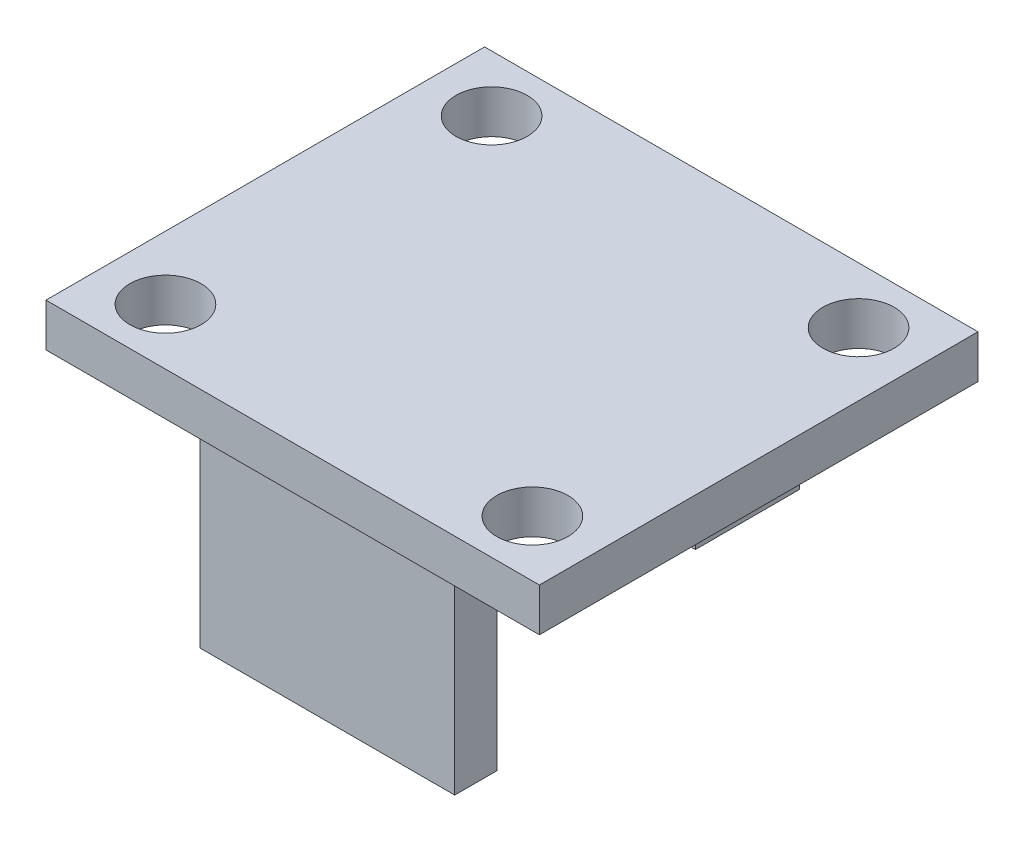
ISO-10303-21;
HEADER;
FILE_DESCRIPTION(('STEP AP214'),'2;1');
FILE_NAME('part.step','',(''),(''),'','','');
FILE_SCHEMA(('AUTOMOTIVE_DESIGN { 1 0 10303 214 1 1 1 1 }'));
ENDSEC;
DATA;
#1=APPLICATION_CONTEXT('core data for automotive mechanical design processes');
#2=APPLICATION_PROTOCOL_DEFINITION('international standard','automotive_design',2000,#1);
#3=PRODUCT_CONTEXT('',#1,'mechanical');
#4=PRODUCT('Part','Part','',(#3));
#5=PRODUCT_RELATED_PRODUCT_CATEGORY('part','',(#4));
#6=PRODUCT_DEFINITION_FORMATION('','',#4);
#7=PRODUCT_DEFINITION_CONTEXT('part definition',#1,'design');
#8=PRODUCT_DEFINITION('design','',#6,#7);
#9=PRODUCT_DEFINITION_SHAPE('','',#8);
#10=(LENGTH_UNIT() NAMED_UNIT(*) SI_UNIT(.MILLI.,.METRE.));
#11=(NAMED_UNIT(*) PLANE_ANGLE_UNIT() SI_UNIT($,.RADIAN.));
#12=(NAMED_UNIT(*) SI_UNIT($,.STERADIAN.) SOLID_ANGLE_UNIT());
#13=UNCERTAINTY_MEASURE_WITH_UNIT(LENGTH_MEASURE(1.E-05),#10,'distance_accuracy_value','');
#14=(GEOMETRIC_REPRESENTATION_CONTEXT(3) GLOBAL_UNCERTAINTY_ASSIGNED_CONTEXT((#13)) GLOBAL_UNIT_ASSIGNED_CONTEXT((#10,
#11,#12)) REPRESENTATION_CONTEXT('',''));
#15=CARTESIAN_POINT('',(0.,0.,0.));
#16=DIRECTION('',(0.,0.,1.));
#17=DIRECTION('',(1.,0.,0.));
#18=AXIS2_PLACEMENT_3D('',#15,#16,#17);
#19=CARTESIAN_POINT('',(0.,0.,0.));
#20=DIRECTION('',(0.,1.,0.));
#21=DIRECTION('',(0.,0.,1.));
#22=AXIS2_PLACEMENT_3D('',#19,#20,#21);
#23=PLANE('',#22);
#24=DIRECTION('',(0.,0.,1.));
#25=VECTOR('',#24,1.);
#26=CARTESIAN_POINT('',(5.89814227713465,0.,6.5862588761337));
#27=LINE('',#26,#25);
#28=CARTESIAN_POINT('',(5.89814227713465,0.,6.5862588761337));
#29=VERTEX_POINT('',#28);
#30=CARTESIAN_POINT('',(5.89814227713465,0.,8.55230630184525));
#31=VERTEX_POINT('',#30);
#32=EDGE_CURVE('E176',#29,#31,#27,.T.);
#33=ORIENTED_EDGE('',*,*,#32,.F.);
#34=DIRECTION('',(1.,0.,0.));
#35=VECTOR('',#34,1.);
#36=CARTESIAN_POINT('',(-5.89814227713465,0.,6.5862588761337));
#37=LINE('',#36,#35);
#38=CARTESIAN_POINT('',(-5.89814227713465,0.,6.5862588761337));
#39=VERTEX_POINT('',#38);
#40=EDGE_CURVE('E193',#39,#29,#37,.T.);
#41=ORIENTED_EDGE('',*,*,#40,.F.);
#42=DIRECTION('',(0.,0.,-1.));
#43=VECTOR('',#42,1.);
#44=CARTESIAN_POINT('',(-5.89814227713465,0.,6.5862588761337));
#45=LINE('',#44,#43);
#46=CARTESIAN_POINT('',(-5.89814227713465,0.,8.55230630184525));
#47=VERTEX_POINT('',#46);
#48=EDGE_CURVE('E206',#47,#39,#45,.T.);
#49=ORIENTED_EDGE('',*,*,#48,.F.);
#50=DIRECTION('',(-1.,0.,0.));
#51=VECTOR('',#50,1.);
#52=CARTESIAN_POINT('',(-5.89814227713465,0.,8.55230630184525));
#53=LINE('',#52,#51);
#54=EDGE_CURVE('E181',#31,#47,#53,.T.);
#55=ORIENTED_EDGE('',*,*,#54,.F.);
#56=EDGE_LOOP('',(#33,#41,#49,#55));
#57=FACE_BOUND('',#56,.T.);
#58=DIRECTION('',(0.,0.,1.));
#59=VECTOR('',#58,1.);
#60=CARTESIAN_POINT('',(-11.43,0.,10.16));
#61=LINE('',#60,#59);
#62=CARTESIAN_POINT('',(-11.43,0.,-10.16));
#63=VERTEX_POINT('',#62);
#64=CARTESIAN_POINT('',(-11.43,0.,10.16));
#65=VERTEX_POINT('',#64);
#66=EDGE_CURVE('E257',#63,#65,#61,.T.);
#67=ORIENTED_EDGE('',*,*,#66,.F.);
#68=DIRECTION('',(-1.,0.,0.));
#69=VECTOR('',#68,1.);
#70=CARTESIAN_POINT('',(11.43,0.,-10.16));
#71=LINE('',#70,#69);
#72=CARTESIAN_POINT('',(11.43,0.,-10.16));
#73=VERTEX_POINT('',#72);
#74=EDGE_CURVE('E266',#73,#63,#71,.T.);
#75=ORIENTED_EDGE('',*,*,#74,.F.);
#76=DIRECTION('',(0.,0.,-1.));
#77=VECTOR('',#76,1.);
#78=CARTESIAN_POINT('',(11.43,0.,10.16));
#79=LINE('',#78,#77);
#80=CARTESIAN_POINT('',(11.43,0.,10.16));
#81=VERTEX_POINT('',#80);
#82=EDGE_CURVE('E282',#81,#73,#79,.T.);
#83=ORIENTED_EDGE('',*,*,#82,.F.);
#84=DIRECTION('',(1.,0.,0.));
#85=VECTOR('',#84,1.);
#86=CARTESIAN_POINT('',(11.43,0.,10.16));
#87=LINE('',#86,#85);
#88=EDGE_CURVE('E279',#65,#81,#87,.T.);
#89=ORIENTED_EDGE('',*,*,#88,.F.);
#90=EDGE_LOOP('',(#67,#75,#83,#89));
#91=FACE_BOUND('',#90,.T.);
#92=CARTESIAN_POINT('',(-8.5,0.,-7.55555555555556));
#93=DIRECTION('',(0.,1.,0.));
#94=DIRECTION('',(0.,0.,1.));
#95=AXIS2_PLACEMENT_3D('',#92,#93,#94);
#96=CIRCLE('',#95,1.65);
#97=CARTESIAN_POINT('',(-8.5,0.,-5.90555555555556));
#98=VERTEX_POINT('',#97);
#99=EDGE_CURVE('E249',#98,#98,#96,.T.);
#100=ORIENTED_EDGE('',*,*,#99,.T.);
#101=EDGE_LOOP('',(#100));
#102=FACE_BOUND('',#101,.T.);
#103=CARTESIAN_POINT('',(8.5,0.,-7.55555555555556));
#104=DIRECTION('',(0.,1.,0.));
#105=DIRECTION('',(0.,0.,1.));
#106=AXIS2_PLACEMENT_3D('',#103,#104,#105);
#107=CIRCLE('',#106,1.65);
#108=CARTESIAN_POINT('',(8.5,0.,-5.90555555555556));
#109=VERTEX_POINT('',#108);
#110=EDGE_CURVE('E241',#109,#109,#107,.T.);
#111=ORIENTED_EDGE('',*,*,#110,.T.);
#112=EDGE_LOOP('',(#111));
#113=FACE_BOUND('',#112,.T.);
#114=CARTESIAN_POINT('',(-8.5,0.,7.55555555555556));
#115=DIRECTION('',(0.,1.,0.));
#116=DIRECTION('',(0.,0.,1.));
#117=AXIS2_PLACEMENT_3D('',#114,#115,#116);
#118=CIRCLE('',#117,1.65);
#119=CARTESIAN_POINT('',(-8.5,0.,9.20555555555555));
#120=VERTEX_POINT('',#119);
#121=EDGE_CURVE('E233',#120,#120,#118,.T.);
#122=ORIENTED_EDGE('',*,*,#121,.T.);
#123=EDGE_LOOP('',(#122));
#124=FACE_BOUND('',#123,.T.);
#125=CARTESIAN_POINT('',(8.5,0.,7.55555555555556));
#126=DIRECTION('',(0.,1.,0.));
#127=DIRECTION('',(0.,0.,1.));
#128=AXIS2_PLACEMENT_3D('',#125,#126,#127);
#129=CIRCLE('',#128,1.65);
#130=CARTESIAN_POINT('',(8.5,0.,9.20555555555556));
#131=VERTEX_POINT('',#130);
#132=EDGE_CURVE('E228',#131,#131,#129,.T.);
#133=ORIENTED_EDGE('',*,*,#132,.T.);
#134=EDGE_LOOP('',(#133));
#135=FACE_BOUND('',#134,.T.);
#136=DIRECTION('',(0.,0.,1.));
#137=VECTOR('',#136,1.);
#138=CARTESIAN_POINT('',(3.62314454166843,0.,-9.70384836547632));
#139=LINE('',#138,#137);
#140=CARTESIAN_POINT('',(3.62314454166843,0.,-9.70384836547632));
#141=VERTEX_POINT('',#140);
#142=CARTESIAN_POINT('',(3.62314454166843,0.,-4.87298897658508));
#143=VERTEX_POINT('',#142);
#144=EDGE_CURVE('E174',#141,#143,#139,.T.);
#145=ORIENTED_EDGE('',*,*,#144,.F.);
#146=DIRECTION('',(1.,0.,0.));
#147=VECTOR('',#146,1.);
#148=CARTESIAN_POINT('',(-3.62314454166843,0.,-9.70384836547632));
#149=LINE('',#148,#147);
#150=CARTESIAN_POINT('',(-3.62314454166843,0.,-9.70384836547632));
#151=VERTEX_POINT('',#150);
#152=EDGE_CURVE('E171',#151,#141,#149,.T.);
#153=ORIENTED_EDGE('',*,*,#152,.F.);
#154=DIRECTION('',(0.,0.,-1.));
#155=VECTOR('',#154,1.);
#156=CARTESIAN_POINT('',(-3.62314454166843,0.,-9.70384836547632));
#157=LINE('',#156,#155);
#158=CARTESIAN_POINT('',(-3.62314454166843,0.,-4.87298897658508));
#159=VERTEX_POINT('',#158);
#160=EDGE_CURVE('E65',#159,#151,#157,.T.);
#161=ORIENTED_EDGE('',*,*,#160,.F.);
#162=DIRECTION('',(-1.,0.,0.));
#163=VECTOR('',#162,1.);
#164=CARTESIAN_POINT('',(-3.62314454166843,0.,-4.87298897658508));
#165=LINE('',#164,#163);
#166=EDGE_CURVE('E57',#143,#159,#165,.T.);
#167=ORIENTED_EDGE('',*,*,#166,.F.);
#168=EDGE_LOOP('',(#145,#153,#161,#167));
#169=FACE_BOUND('',#168,.T.);
#170=ADVANCED_FACE('F38',(#57,#91,#102,#113,#124,#135,#169),#23,.F.);
#171=CARTESIAN_POINT('',(0.,2.,0.));
#172=DIRECTION('',(0.,1.,0.));
#173=DIRECTION('',(0.,0.,1.));
#174=AXIS2_PLACEMENT_3D('',#171,#172,#173);
#175=PLANE('',#174);
#176=CARTESIAN_POINT('',(-8.5,2.,7.55555555555556));
#177=DIRECTION('',(0.,1.,0.));
#178=DIRECTION('',(0.,0.,1.));
#179=AXIS2_PLACEMENT_3D('',#176,#177,#178);
#180=CIRCLE('',#179,1.65);
#181=CARTESIAN_POINT('',(-8.5,2.,9.20555555555555));
#182=VERTEX_POINT('',#181);
#183=EDGE_CURVE('E237',#182,#182,#180,.T.);
#184=ORIENTED_EDGE('',*,*,#183,.F.);
#185=EDGE_LOOP('',(#184));
#186=FACE_BOUND('',#185,.T.);
#187=CARTESIAN_POINT('',(-8.5,2.,-7.55555555555556));
#188=DIRECTION('',(0.,1.,0.));
#189=DIRECTION('',(0.,0.,1.));
#190=AXIS2_PLACEMENT_3D('',#187,#188,#189);
#191=CIRCLE('',#190,1.65);
#192=CARTESIAN_POINT('',(-8.5,2.,-5.90555555555556));
#193=VERTEX_POINT('',#192);
#194=EDGE_CURVE('E253',#193,#193,#191,.T.);
#195=ORIENTED_EDGE('',*,*,#194,.F.);
#196=EDGE_LOOP('',(#195));
#197=FACE_BOUND('',#196,.T.);
#198=DIRECTION('',(0.,0.,1.));
#199=VECTOR('',#198,1.);
#200=CARTESIAN_POINT('',(-11.43,2.,10.16));
#201=LINE('',#200,#199);
#202=CARTESIAN_POINT('',(-11.43,2.,-10.16));
#203=VERTEX_POINT('',#202);
#204=CARTESIAN_POINT('',(-11.43,2.,10.16));
#205=VERTEX_POINT('',#204);
#206=EDGE_CURVE('E261',#203,#205,#201,.T.);
#207=ORIENTED_EDGE('',*,*,#206,.T.);
#208=DIRECTION('',(1.,0.,0.));
#209=VECTOR('',#208,1.);
#210=CARTESIAN_POINT('',(11.43,2.,10.16));
#211=LINE('',#210,#209);
#212=CARTESIAN_POINT('',(11.43,2.,10.16));
#213=VERTEX_POINT('',#212);
#214=EDGE_CURVE('E265',#205,#213,#211,.T.);
#215=ORIENTED_EDGE('',*,*,#214,.T.);
#216=DIRECTION('',(0.,0.,-1.));
#217=VECTOR('',#216,1.);
#218=CARTESIAN_POINT('',(11.43,2.,10.16));
#219=LINE('',#218,#217);
#220=CARTESIAN_POINT('',(11.43,2.,-10.16));
#221=VERTEX_POINT('',#220);
#222=EDGE_CURVE('E269',#213,#221,#219,.T.);
#223=ORIENTED_EDGE('',*,*,#222,.T.);
#224=DIRECTION('',(-1.,0.,0.));
#225=VECTOR('',#224,1.);
#226=CARTESIAN_POINT('',(11.43,2.,-10.16));
#227=LINE('',#226,#225);
#228=EDGE_CURVE('E272',#221,#203,#227,.T.);
#229=ORIENTED_EDGE('',*,*,#228,.T.);
#230=EDGE_LOOP('',(#207,#215,#223,#229));
#231=FACE_BOUND('',#230,.T.);
#232=CARTESIAN_POINT('',(8.5,2.,-7.55555555555556));
#233=DIRECTION('',(0.,1.,0.));
#234=DIRECTION('',(0.,0.,1.));
#235=AXIS2_PLACEMENT_3D('',#232,#233,#234);
#236=CIRCLE('',#235,1.65);
#237=CARTESIAN_POINT('',(8.5,2.,-5.90555555555556));
#238=VERTEX_POINT('',#237);
#239=EDGE_CURVE('E245',#238,#238,#236,.T.);
#240=ORIENTED_EDGE('',*,*,#239,.F.);
#241=EDGE_LOOP('',(#240));
#242=FACE_BOUND('',#241,.T.);
#243=CARTESIAN_POINT('',(8.5,2.,7.55555555555556));
#244=DIRECTION('',(0.,1.,0.));
#245=DIRECTION('',(0.,0.,1.));
#246=AXIS2_PLACEMENT_3D('',#243,#244,#245);
#247=CIRCLE('',#246,1.65);
#248=CARTESIAN_POINT('',(8.5,2.,9.20555555555556));
#249=VERTEX_POINT('',#248);
#250=EDGE_CURVE('E229',#249,#249,#247,.T.);
#251=ORIENTED_EDGE('',*,*,#250,.F.);
#252=EDGE_LOOP('',(#251));
#253=FACE_BOUND('',#252,.T.);
#254=ADVANCED_FACE('F314',(#186,#197,#231,#242,#253),#175,.T.);
#255=CARTESIAN_POINT('',(-11.43,2.,10.16));
#256=DIRECTION('',(1.,0.,0.));
#257=DIRECTION('',(0.,0.,-1.));
#258=AXIS2_PLACEMENT_3D('',#255,#256,#257);
#259=PLANE('',#258);
#260=ORIENTED_EDGE('',*,*,#66,.T.);
#261=DIRECTION('',(0.,-1.,0.));
#262=VECTOR('',#261,1.);
#263=CARTESIAN_POINT('',(-11.43,2.,10.16));
#264=LINE('',#263,#262);
#265=EDGE_CURVE('E11',#205,#65,#264,.T.);
#266=ORIENTED_EDGE('',*,*,#265,.F.);
#267=ORIENTED_EDGE('',*,*,#206,.F.);
#268=DIRECTION('',(0.,-1.,0.));
#269=VECTOR('',#268,1.);
#270=CARTESIAN_POINT('',(-11.43,2.,-10.16));
#271=LINE('',#270,#269);
#272=EDGE_CURVE('E275',#203,#63,#271,.T.);
#273=ORIENTED_EDGE('',*,*,#272,.T.);
#274=EDGE_LOOP('',(#260,#266,#267,#273));
#275=FACE_BOUND('',#274,.T.);
#276=ADVANCED_FACE('F40',(#275),#259,.F.);
#277=CARTESIAN_POINT('',(11.43,2.,10.16));
#278=DIRECTION('',(0.,0.,-1.));
#279=DIRECTION('',(-1.,0.,0.));
#280=AXIS2_PLACEMENT_3D('',#277,#278,#279);
#281=PLANE('',#280);
#282=ORIENTED_EDGE('',*,*,#88,.T.);
#283=DIRECTION('',(0.,-1.,0.));
#284=VECTOR('',#283,1.);
#285=CARTESIAN_POINT('',(11.43,2.,10.16));
#286=LINE('',#285,#284);
#287=EDGE_CURVE('E47',#213,#81,#286,.T.);
#288=ORIENTED_EDGE('',*,*,#287,.F.);
#289=ORIENTED_EDGE('',*,*,#214,.F.);
#290=ORIENTED_EDGE('',*,*,#265,.T.);
#291=EDGE_LOOP('',(#282,#288,#289,#290));
#292=FACE_BOUND('',#291,.T.);
#293=ADVANCED_FACE('F316',(#292),#281,.F.);
#294=CARTESIAN_POINT('',(11.43,2.,10.16));
#295=DIRECTION('',(-1.,0.,0.));
#296=DIRECTION('',(0.,0.,1.));
#297=AXIS2_PLACEMENT_3D('',#294,#295,#296);
#298=PLANE('',#297);
#299=ORIENTED_EDGE('',*,*,#82,.T.);
#300=DIRECTION('',(0.,-1.,0.));
#301=VECTOR('',#300,1.);
#302=CARTESIAN_POINT('',(11.43,2.,-10.16));
#303=LINE('',#302,#301);
#304=EDGE_CURVE('E290',#221,#73,#303,.T.);
#305=ORIENTED_EDGE('',*,*,#304,.F.);
#306=ORIENTED_EDGE('',*,*,#222,.F.);
#307=ORIENTED_EDGE('',*,*,#287,.T.);
#308=EDGE_LOOP('',(#299,#305,#306,#307));
#309=FACE_BOUND('',#308,.T.);
#310=ADVANCED_FACE('F299',(#309),#298,.F.);
#311=CARTESIAN_POINT('',(11.43,2.,-10.16));
#312=DIRECTION('',(0.,0.,1.));
#313=DIRECTION('',(1.,0.,0.));
#314=AXIS2_PLACEMENT_3D('',#311,#312,#313);
#315=PLANE('',#314);
#316=ORIENTED_EDGE('',*,*,#74,.T.);
#317=ORIENTED_EDGE('',*,*,#272,.F.);
#318=ORIENTED_EDGE('',*,*,#228,.F.);
#319=ORIENTED_EDGE('',*,*,#304,.T.);
#320=EDGE_LOOP('',(#316,#317,#318,#319));
#321=FACE_BOUND('',#320,.T.);
#322=ADVANCED_FACE('F308',(#321),#315,.F.);
#323=CARTESIAN_POINT('',(-8.5,2.,-7.55555555555556));
#324=DIRECTION('',(0.,-1.,0.));
#325=DIRECTION('',(0.,0.,-1.));
#326=AXIS2_PLACEMENT_3D('',#323,#324,#325);
#327=CYLINDRICAL_SURFACE('',#326,1.65);
#328=ORIENTED_EDGE('',*,*,#194,.T.);
#329=EDGE_LOOP('',(#328));
#330=FACE_BOUND('',#329,.T.);
#331=ORIENTED_EDGE('',*,*,#99,.F.);
#332=EDGE_LOOP('',(#331));
#333=FACE_BOUND('',#332,.T.);
#334=ADVANCED_FACE('F334',(#330,#333),#327,.F.);
#335=CARTESIAN_POINT('',(8.5,2.,-7.55555555555556));
#336=DIRECTION('',(0.,-1.,0.));
#337=DIRECTION('',(0.,0.,-1.));
#338=AXIS2_PLACEMENT_3D('',#335,#336,#337);
#339=CYLINDRICAL_SURFACE('',#338,1.65);
#340=ORIENTED_EDGE('',*,*,#239,.T.);
#341=EDGE_LOOP('',(#340));
#342=FACE_BOUND('',#341,.T.);
#343=ORIENTED_EDGE('',*,*,#110,.F.);
#344=EDGE_LOOP('',(#343));
#345=FACE_BOUND('',#344,.T.);
#346=ADVANCED_FACE('F338',(#342,#345),#339,.F.);
#347=CARTESIAN_POINT('',(-8.5,2.,7.55555555555556));
#348=DIRECTION('',(0.,-1.,0.));
#349=DIRECTION('',(0.,0.,-1.));
#350=AXIS2_PLACEMENT_3D('',#347,#348,#349);
#351=CYLINDRICAL_SURFACE('',#350,1.65);
#352=ORIENTED_EDGE('',*,*,#183,.T.);
#353=EDGE_LOOP('',(#352));
#354=FACE_BOUND('',#353,.T.);
#355=ORIENTED_EDGE('',*,*,#121,.F.);
#356=EDGE_LOOP('',(#355));
#357=FACE_BOUND('',#356,.T.);
#358=ADVANCED_FACE('F343',(#354,#357),#351,.F.);
#359=CARTESIAN_POINT('',(8.5,2.,7.55555555555556));
#360=DIRECTION('',(0.,-1.,0.));
#361=DIRECTION('',(0.,0.,-1.));
#362=AXIS2_PLACEMENT_3D('',#359,#360,#361);
#363=CYLINDRICAL_SURFACE('',#362,1.65);
#364=ORIENTED_EDGE('',*,*,#250,.T.);
#365=EDGE_LOOP('',(#364));
#366=FACE_BOUND('',#365,.T.);
#367=ORIENTED_EDGE('',*,*,#132,.F.);
#368=EDGE_LOOP('',(#367));
#369=FACE_BOUND('',#368,.T.);
#370=ADVANCED_FACE('F350',(#366,#369),#363,.F.);
#371=CARTESIAN_POINT('',(5.89814227713465,-10.,6.5862588761337));
#372=DIRECTION('',(-1.,0.,0.));
#373=DIRECTION('',(0.,0.,1.));
#374=AXIS2_PLACEMENT_3D('',#371,#372,#373);
#375=PLANE('',#374);
#376=ORIENTED_EDGE('',*,*,#32,.T.);
#377=DIRECTION('',(0.,1.,0.));
#378=VECTOR('',#377,1.);
#379=CARTESIAN_POINT('',(5.89814227713465,-10.,8.55230630184525));
#380=LINE('',#379,#378);
#381=CARTESIAN_POINT('',(5.89814227713465,-10.,8.55230630184525));
#382=VERTEX_POINT('',#381);
#383=EDGE_CURVE('E224',#382,#31,#380,.T.);
#384=ORIENTED_EDGE('',*,*,#383,.F.);
#385=DIRECTION('',(0.,0.,1.));
#386=VECTOR('',#385,1.);
#387=CARTESIAN_POINT('',(5.89814227713465,-10.,6.5862588761337));
#388=LINE('',#387,#386);
#389=CARTESIAN_POINT('',(5.89814227713465,-10.,6.5862588761337));
#390=VERTEX_POINT('',#389);
#391=EDGE_CURVE('E188',#390,#382,#388,.T.);
#392=ORIENTED_EDGE('',*,*,#391,.F.);
#393=DIRECTION('',(0.,1.,0.));
#394=VECTOR('',#393,1.);
#395=CARTESIAN_POINT('',(5.89814227713465,-10.,6.5862588761337));
#396=LINE('',#395,#394);
#397=EDGE_CURVE('E201',#390,#29,#396,.T.);
#398=ORIENTED_EDGE('',*,*,#397,.T.);
#399=EDGE_LOOP('',(#376,#384,#392,#398));
#400=FACE_BOUND('',#399,.T.);
#401=ADVANCED_FACE('F354',(#400),#375,.F.);
#402=CARTESIAN_POINT('',(-5.89814227713465,-10.,8.55230630184525));
#403=DIRECTION('',(0.,0.,-1.));
#404=DIRECTION('',(-1.,0.,0.));
#405=AXIS2_PLACEMENT_3D('',#402,#403,#404);
#406=PLANE('',#405);
#407=ORIENTED_EDGE('',*,*,#54,.T.);
#408=DIRECTION('',(0.,1.,0.));
#409=VECTOR('',#408,1.);
#410=CARTESIAN_POINT('',(-5.89814227713465,-10.,8.55230630184525));
#411=LINE('',#410,#409);
#412=CARTESIAN_POINT('',(-5.89814227713465,-10.,8.55230630184525));
#413=VERTEX_POINT('',#412);
#414=EDGE_CURVE('E220',#413,#47,#411,.T.);
#415=ORIENTED_EDGE('',*,*,#414,.F.);
#416=DIRECTION('',(-1.,0.,0.));
#417=VECTOR('',#416,1.);
#418=CARTESIAN_POINT('',(-5.89814227713465,-10.,8.55230630184525));
#419=LINE('',#418,#417);
#420=EDGE_CURVE('E192',#382,#413,#419,.T.);
#421=ORIENTED_EDGE('',*,*,#420,.F.);
#422=ORIENTED_EDGE('',*,*,#383,.T.);
#423=EDGE_LOOP('',(#407,#415,#421,#422));
#424=FACE_BOUND('',#423,.T.);
#425=ADVANCED_FACE('F358',(#424),#406,.F.);
#426=CARTESIAN_POINT('',(-5.89814227713465,-10.,6.5862588761337));
#427=DIRECTION('',(1.,0.,0.));
#428=DIRECTION('',(0.,0.,-1.));
#429=AXIS2_PLACEMENT_3D('',#426,#427,#428);
#430=PLANE('',#429);
#431=ORIENTED_EDGE('',*,*,#48,.T.);
#432=DIRECTION('',(0.,1.,0.));
#433=VECTOR('',#432,1.);
#434=CARTESIAN_POINT('',(-5.89814227713465,-10.,6.5862588761337));
#435=LINE('',#434,#433);
#436=CARTESIAN_POINT('',(-5.89814227713465,-10.,6.5862588761337));
#437=VERTEX_POINT('',#436);
#438=EDGE_CURVE('E216',#437,#39,#435,.T.);
#439=ORIENTED_EDGE('',*,*,#438,.F.);
#440=DIRECTION('',(0.,0.,-1.));
#441=VECTOR('',#440,1.);
#442=CARTESIAN_POINT('',(-5.89814227713465,-10.,6.5862588761337));
#443=LINE('',#442,#441);
#444=EDGE_CURVE('E196',#413,#437,#443,.T.);
#445=ORIENTED_EDGE('',*,*,#444,.F.);
#446=ORIENTED_EDGE('',*,*,#414,.T.);
#447=EDGE_LOOP('',(#431,#439,#445,#446));
#448=FACE_BOUND('',#447,.T.);
#449=ADVANCED_FACE('F362',(#448),#430,.F.);
#450=CARTESIAN_POINT('',(-5.89814227713465,-10.,6.5862588761337));
#451=DIRECTION('',(0.,0.,1.));
#452=DIRECTION('',(1.,0.,0.));
#453=AXIS2_PLACEMENT_3D('',#450,#451,#452);
#454=PLANE('',#453);
#455=ORIENTED_EDGE('',*,*,#40,.T.);
#456=ORIENTED_EDGE('',*,*,#397,.F.);
#457=DIRECTION('',(1.,0.,0.));
#458=VECTOR('',#457,1.);
#459=CARTESIAN_POINT('',(-5.89814227713465,-10.,6.5862588761337));
#460=LINE('',#459,#458);
#461=EDGE_CURVE('E199',#437,#390,#460,.T.);
#462=ORIENTED_EDGE('',*,*,#461,.F.);
#463=ORIENTED_EDGE('',*,*,#438,.T.);
#464=EDGE_LOOP('',(#455,#456,#462,#463));
#465=FACE_BOUND('',#464,.T.);
#466=ADVANCED_FACE('F366',(#465),#454,.F.);
#467=CARTESIAN_POINT('',(0.,-10.,0.));
#468=DIRECTION('',(0.,1.,0.));
#469=DIRECTION('',(0.,0.,1.));
#470=AXIS2_PLACEMENT_3D('',#467,#468,#469);
#471=PLANE('',#470);
#472=ORIENTED_EDGE('',*,*,#391,.T.);
#473=ORIENTED_EDGE('',*,*,#420,.T.);
#474=ORIENTED_EDGE('',*,*,#444,.T.);
#475=ORIENTED_EDGE('',*,*,#461,.T.);
#476=EDGE_LOOP('',(#472,#473,#474,#475));
#477=FACE_BOUND('',#476,.T.);
#478=ADVANCED_FACE('F370',(#477),#471,.F.);
#479=CARTESIAN_POINT('',(3.62314454166843,-8.,-9.70384836547632));
#480=DIRECTION('',(-1.,0.,0.));
#481=DIRECTION('',(0.,0.,1.));
#482=AXIS2_PLACEMENT_3D('',#479,#480,#481);
#483=PLANE('',#482);
#484=ORIENTED_EDGE('',*,*,#144,.T.);
#485=DIRECTION('',(0.,1.,0.));
#486=VECTOR('',#485,1.);
#487=CARTESIAN_POINT('',(3.62314454166843,-8.,-4.87298897658508));
#488=LINE('',#487,#486);
#489=CARTESIAN_POINT('',(3.62314454166843,-8.,-4.87298897658508));
#490=VERTEX_POINT('',#489);
#491=EDGE_CURVE('E153',#490,#143,#488,.T.);
#492=ORIENTED_EDGE('',*,*,#491,.F.);
#493=DIRECTION('',(0.,0.,1.));
#494=VECTOR('',#493,1.);
#495=CARTESIAN_POINT('',(3.62314454166843,-8.,-9.70384836547632));
#496=LINE('',#495,#494);
#497=CARTESIAN_POINT('',(3.62314454166843,-8.,-9.70384836547632));
#498=VERTEX_POINT('',#497);
#499=EDGE_CURVE('E161',#498,#490,#496,.T.);
#500=ORIENTED_EDGE('',*,*,#499,.F.);
#501=DIRECTION('',(0.,1.,0.));
#502=VECTOR('',#501,1.);
#503=CARTESIAN_POINT('',(3.62314454166843,-8.,-9.70384836547632));
#504=LINE('',#503,#502);
#505=EDGE_CURVE('E516',#498,#141,#504,.T.);
#506=ORIENTED_EDGE('',*,*,#505,.T.);
#507=EDGE_LOOP('',(#484,#492,#500,#506));
#508=FACE_BOUND('',#507,.T.);
#509=ADVANCED_FACE('F173',(#508),#483,.F.);
#510=CARTESIAN_POINT('',(-3.62314454166843,-8.,-4.87298897658508));
#511=DIRECTION('',(0.,0.,-1.));
#512=DIRECTION('',(-1.,0.,0.));
#513=AXIS2_PLACEMENT_3D('',#510,#511,#512);
#514=PLANE('',#513);
#515=ORIENTED_EDGE('',*,*,#166,.T.);
#516=DIRECTION('',(0.,1.,0.));
#517=VECTOR('',#516,1.);
#518=CARTESIAN_POINT('',(-3.62314454166843,-8.,-4.87298897658508));
#519=LINE('',#518,#517);
#520=CARTESIAN_POINT('',(-3.62314454166843,-8.,-4.87298897658508));
#521=VERTEX_POINT('',#520);
#522=EDGE_CURVE('E156',#521,#159,#519,.T.);
#523=ORIENTED_EDGE('',*,*,#522,.F.);
#524=DIRECTION('',(-1.,0.,0.));
#525=VECTOR('',#524,1.);
#526=CARTESIAN_POINT('',(-3.62314454166843,-8.,-4.87298897658508));
#527=LINE('',#526,#525);
#528=EDGE_CURVE('E149',#490,#521,#527,.T.);
#529=ORIENTED_EDGE('',*,*,#528,.F.);
#530=ORIENTED_EDGE('',*,*,#491,.T.);
#531=EDGE_LOOP('',(#515,#523,#529,#530));
#532=FACE_BOUND('',#531,.T.);
#533=ADVANCED_FACE('F151',(#532),#514,.F.);
#534=CARTESIAN_POINT('',(-3.62314454166843,-8.,-9.70384836547632));
#535=DIRECTION('',(1.,0.,0.));
#536=DIRECTION('',(0.,0.,-1.));
#537=AXIS2_PLACEMENT_3D('',#534,#535,#536);
#538=PLANE('',#537);
#539=ORIENTED_EDGE('',*,*,#160,.T.);
#540=DIRECTION('',(0.,1.,0.));
#541=VECTOR('',#540,1.);
#542=CARTESIAN_POINT('',(-3.62314454166843,-8.,-9.70384836547632));
#543=LINE('',#542,#541);
#544=CARTESIAN_POINT('',(-3.62314454166843,-8.,-9.70384836547632));
#545=VERTEX_POINT('',#544);
#546=EDGE_CURVE('E184',#545,#151,#543,.T.);
#547=ORIENTED_EDGE('',*,*,#546,.F.);
#548=DIRECTION('',(0.,0.,-1.));
#549=VECTOR('',#548,1.);
#550=CARTESIAN_POINT('',(-3.62314454166843,-8.,-9.70384836547632));
#551=LINE('',#550,#549);
#552=EDGE_CURVE('E160',#521,#545,#551,.T.);
#553=ORIENTED_EDGE('',*,*,#552,.F.);
#554=ORIENTED_EDGE('',*,*,#522,.T.);
#555=EDGE_LOOP('',(#539,#547,#553,#554));
#556=FACE_BOUND('',#555,.T.);
#557=ADVANCED_FACE('F379',(#556),#538,.F.);
#558=CARTESIAN_POINT('',(-3.62314454166843,-8.,-9.70384836547632));
#559=DIRECTION('',(0.,0.,1.));
#560=DIRECTION('',(1.,0.,0.));
#561=AXIS2_PLACEMENT_3D('',#558,#559,#560);
#562=PLANE('',#561);
#563=ORIENTED_EDGE('',*,*,#152,.T.);
#564=ORIENTED_EDGE('',*,*,#505,.F.);
#565=DIRECTION('',(1.,0.,0.));
#566=VECTOR('',#565,1.);
#567=CARTESIAN_POINT('',(-3.62314454166843,-8.,-9.70384836547632));
#568=LINE('',#567,#566);
#569=EDGE_CURVE('E166',#545,#498,#568,.T.);
#570=ORIENTED_EDGE('',*,*,#569,.F.);
#571=ORIENTED_EDGE('',*,*,#546,.T.);
#572=EDGE_LOOP('',(#563,#564,#570,#571));
#573=FACE_BOUND('',#572,.T.);
#574=ADVANCED_FACE('F382',(#573),#562,.F.);
#575=CARTESIAN_POINT('',(0.,-8.,0.));
#576=DIRECTION('',(0.,1.,0.));
#577=DIRECTION('',(0.,0.,1.));
#578=AXIS2_PLACEMENT_3D('',#575,#576,#577);
#579=PLANE('',#578);
#580=ORIENTED_EDGE('',*,*,#499,.T.);
#581=ORIENTED_EDGE('',*,*,#528,.T.);
#582=ORIENTED_EDGE('',*,*,#552,.T.);
#583=ORIENTED_EDGE('',*,*,#569,.T.);
#584=EDGE_LOOP('',(#580,#581,#582,#583));
#585=FACE_BOUND('',#584,.T.);
#586=ADVANCED_FACE('F164',(#585),#579,.F.);
#587=CLOSED_SHELL('',(#170,#254,#276,#293,#310,#322,#334,#346,#358,#370,#401,#425,#449,#466,
#478,#509,#533,#557,#574,#586));
#588=MANIFOLD_SOLID_BREP('B2',#587);
#589=ADVANCED_BREP_SHAPE_REPRESENTATION('',(#18,#588),#14);
#590=SHAPE_DEFINITION_REPRESENTATION(#9,#589);
ENDSEC;
END-ISO-10303-21;
